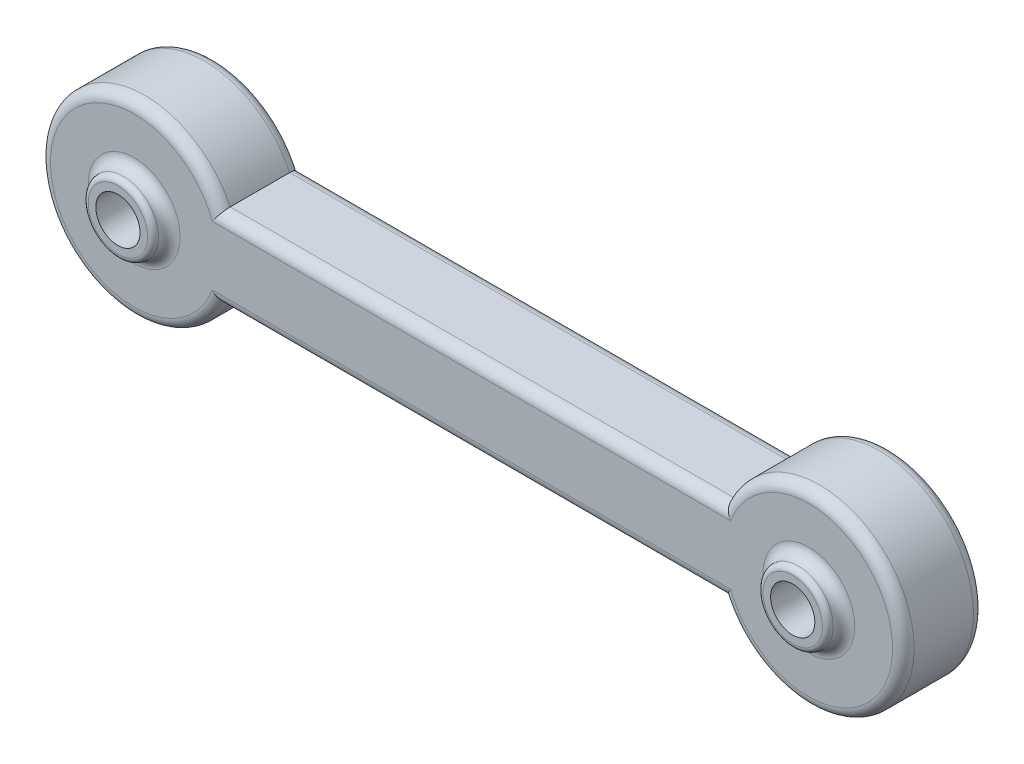
ISO-10303-21;
HEADER;
FILE_DESCRIPTION(('STEP AP214'),'2;1');
FILE_NAME('part.step','',(''),(''),'','','');
FILE_SCHEMA(('AUTOMOTIVE_DESIGN { 1 0 10303 214 1 1 1 1 }'));
ENDSEC;
DATA;
#1=APPLICATION_CONTEXT('core data for automotive mechanical design processes');
#2=APPLICATION_PROTOCOL_DEFINITION('international standard','automotive_design',2000,#1);
#3=PRODUCT_CONTEXT('',#1,'mechanical');
#4=PRODUCT('Part','Part','',(#3));
#5=PRODUCT_RELATED_PRODUCT_CATEGORY('part','',(#4));
#6=PRODUCT_DEFINITION_FORMATION('','',#4);
#7=PRODUCT_DEFINITION_CONTEXT('part definition',#1,'design');
#8=PRODUCT_DEFINITION('design','',#6,#7);
#9=PRODUCT_DEFINITION_SHAPE('','',#8);
#10=(LENGTH_UNIT() NAMED_UNIT(*) SI_UNIT(.MILLI.,.METRE.));
#11=(NAMED_UNIT(*) PLANE_ANGLE_UNIT() SI_UNIT($,.RADIAN.));
#12=(NAMED_UNIT(*) SI_UNIT($,.STERADIAN.) SOLID_ANGLE_UNIT());
#13=UNCERTAINTY_MEASURE_WITH_UNIT(LENGTH_MEASURE(1.E-05),#10,'distance_accuracy_value','');
#14=(GEOMETRIC_REPRESENTATION_CONTEXT(3) GLOBAL_UNCERTAINTY_ASSIGNED_CONTEXT((#13)) GLOBAL_UNIT_ASSIGNED_CONTEXT((#10,
#11,#12)) REPRESENTATION_CONTEXT('',''));
#15=CARTESIAN_POINT('',(0.,0.,0.));
#16=DIRECTION('',(0.,0.,1.));
#17=DIRECTION('',(1.,0.,0.));
#18=AXIS2_PLACEMENT_3D('',#15,#16,#17);
#19=CARTESIAN_POINT('',(-62.5,0.,15.));
#20=DIRECTION('',(0.,0.,1.));
#21=DIRECTION('',(1.,0.,0.));
#22=AXIS2_PLACEMENT_3D('',#19,#20,#21);
#23=PLANE('',#22);
#24=CARTESIAN_POINT('',(62.5,0.,15.));
#25=DIRECTION('',(0.,0.,1.));
#26=DIRECTION('',(1.,0.,0.));
#27=AXIS2_PLACEMENT_3D('',#24,#25,#26);
#28=CIRCLE('',#27,8.49999999999999);
#29=CARTESIAN_POINT('',(71.,0.,15.));
#30=VERTEX_POINT('',#29);
#31=EDGE_CURVE('E157',#30,#30,#28,.F.);
#32=ORIENTED_EDGE('',*,*,#31,.T.);
#33=EDGE_LOOP('',(#32));
#34=FACE_BOUND('',#33,.T.);
#35=CARTESIAN_POINT('',(62.5,0.,15.));
#36=DIRECTION('',(0.,0.,1.));
#37=DIRECTION('',(1.,0.,0.));
#38=AXIS2_PLACEMENT_3D('',#35,#36,#37);
#39=CIRCLE('',#38,15.5);
#40=CARTESIAN_POINT('',(48.0086232538106,-5.50000000000001,15.));
#41=VERTEX_POINT('',#40);
#42=CARTESIAN_POINT('',(48.0086232538106,5.49999999999999,15.));
#43=VERTEX_POINT('',#42);
#44=EDGE_CURVE('E154',#41,#43,#39,.T.);
#45=ORIENTED_EDGE('',*,*,#44,.T.);
#46=DIRECTION('',(-1.,0.,0.));
#47=VECTOR('',#46,1.);
#48=CARTESIAN_POINT('',(-46.6886116991581,5.49999999999999,15.));
#49=LINE('',#48,#47);
#50=CARTESIAN_POINT('',(-48.0086232538106,5.49999999999999,15.));
#51=VERTEX_POINT('',#50);
#52=EDGE_CURVE('E133',#43,#51,#49,.T.);
#53=ORIENTED_EDGE('',*,*,#52,.T.);
#54=CARTESIAN_POINT('',(-62.5,0.,15.));
#55=DIRECTION('',(0.,0.,1.));
#56=DIRECTION('',(1.,0.,0.));
#57=AXIS2_PLACEMENT_3D('',#54,#55,#56);
#58=CIRCLE('',#57,15.5);
#59=CARTESIAN_POINT('',(-48.0086232538106,-5.50000000000001,15.));
#60=VERTEX_POINT('',#59);
#61=EDGE_CURVE('E142',#51,#60,#58,.T.);
#62=ORIENTED_EDGE('',*,*,#61,.T.);
#63=DIRECTION('',(1.,0.,0.));
#64=VECTOR('',#63,1.);
#65=CARTESIAN_POINT('',(46.6886116991581,-5.50000000000001,15.));
#66=LINE('',#65,#64);
#67=EDGE_CURVE('E149',#60,#41,#66,.T.);
#68=ORIENTED_EDGE('',*,*,#67,.T.);
#69=EDGE_LOOP('',(#45,#53,#62,#68));
#70=FACE_BOUND('',#69,.T.);
#71=CARTESIAN_POINT('',(-62.5,0.,15.));
#72=DIRECTION('',(0.,0.,1.));
#73=DIRECTION('',(1.,0.,0.));
#74=AXIS2_PLACEMENT_3D('',#71,#72,#73);
#75=CIRCLE('',#74,8.49999999999999);
#76=CARTESIAN_POINT('',(-54.,0.,15.));
#77=VERTEX_POINT('',#76);
#78=EDGE_CURVE('E150',#77,#77,#75,.F.);
#79=ORIENTED_EDGE('',*,*,#78,.T.);
#80=EDGE_LOOP('',(#79));
#81=FACE_BOUND('',#80,.T.);
#82=ADVANCED_FACE('F40',(#34,#70,#81),#23,.T.);
#83=CARTESIAN_POINT('',(-62.5,0.,0.));
#84=DIRECTION('',(0.,0.,1.));
#85=DIRECTION('',(1.,0.,0.));
#86=AXIS2_PLACEMENT_3D('',#83,#84,#85);
#87=PLANE('',#86);
#88=CARTESIAN_POINT('',(-62.5,0.,0.));
#89=DIRECTION('',(0.,0.,1.));
#90=DIRECTION('',(1.,0.,0.));
#91=AXIS2_PLACEMENT_3D('',#88,#89,#90);
#92=CIRCLE('',#91,8.49999999999999);
#93=CARTESIAN_POINT('',(-54.,0.,0.));
#94=VERTEX_POINT('',#93);
#95=EDGE_CURVE('E11',#94,#94,#92,.T.);
#96=ORIENTED_EDGE('',*,*,#95,.T.);
#97=EDGE_LOOP('',(#96));
#98=FACE_BOUND('',#97,.T.);
#99=CARTESIAN_POINT('',(62.5,0.,0.));
#100=DIRECTION('',(0.,0.,1.));
#101=DIRECTION('',(1.,0.,0.));
#102=AXIS2_PLACEMENT_3D('',#99,#100,#101);
#103=CIRCLE('',#102,8.49999999999999);
#104=CARTESIAN_POINT('',(71.,0.,0.));
#105=VERTEX_POINT('',#104);
#106=EDGE_CURVE('E54',#105,#105,#103,.T.);
#107=ORIENTED_EDGE('',*,*,#106,.T.);
#108=EDGE_LOOP('',(#107));
#109=FACE_BOUND('',#108,.T.);
#110=CARTESIAN_POINT('',(62.5,0.,0.));
#111=DIRECTION('',(0.,0.,1.));
#112=DIRECTION('',(1.,0.,0.));
#113=AXIS2_PLACEMENT_3D('',#110,#111,#112);
#114=CIRCLE('',#113,15.5);
#115=CARTESIAN_POINT('',(48.0086232538106,5.49999999999999,0.));
#116=VERTEX_POINT('',#115);
#117=CARTESIAN_POINT('',(48.0086232538106,-5.50000000000001,0.));
#118=VERTEX_POINT('',#117);
#119=EDGE_CURVE('E65',#116,#118,#114,.F.);
#120=ORIENTED_EDGE('',*,*,#119,.T.);
#121=DIRECTION('',(1.,0.,0.));
#122=VECTOR('',#121,1.);
#123=CARTESIAN_POINT('',(-62.5,-5.50000000000001,0.));
#124=LINE('',#123,#122);
#125=CARTESIAN_POINT('',(-48.0086232538106,-5.50000000000001,0.));
#126=VERTEX_POINT('',#125);
#127=EDGE_CURVE('E199',#118,#126,#124,.F.);
#128=ORIENTED_EDGE('',*,*,#127,.T.);
#129=CARTESIAN_POINT('',(-62.5,0.,0.));
#130=DIRECTION('',(0.,0.,1.));
#131=DIRECTION('',(1.,0.,0.));
#132=AXIS2_PLACEMENT_3D('',#129,#130,#131);
#133=CIRCLE('',#132,15.5);
#134=CARTESIAN_POINT('',(-48.0086232538106,5.49999999999999,0.));
#135=VERTEX_POINT('',#134);
#136=EDGE_CURVE('E192',#126,#135,#133,.F.);
#137=ORIENTED_EDGE('',*,*,#136,.T.);
#138=DIRECTION('',(-1.,0.,0.));
#139=VECTOR('',#138,1.);
#140=CARTESIAN_POINT('',(-62.5,5.49999999999999,0.));
#141=LINE('',#140,#139);
#142=EDGE_CURVE('E71',#135,#116,#141,.F.);
#143=ORIENTED_EDGE('',*,*,#142,.T.);
#144=EDGE_LOOP('',(#120,#128,#137,#143));
#145=FACE_BOUND('',#144,.T.);
#146=ADVANCED_FACE('F282',(#98,#109,#145),#87,.F.);
#147=CARTESIAN_POINT('',(-62.5,0.,15.));
#148=DIRECTION('',(0.,0.,-1.));
#149=DIRECTION('',(-1.,0.,0.));
#150=AXIS2_PLACEMENT_3D('',#147,#148,#149);
#151=CYLINDRICAL_SURFACE('',#150,17.5);
#152=DIRECTION('',(0.,0.,-1.));
#153=VECTOR('',#152,1.);
#154=CARTESIAN_POINT('',(-46.6886116991581,-7.50000000000001,15.));
#155=LINE('',#154,#153);
#156=CARTESIAN_POINT('',(-46.6886116991581,-7.50000000000001,13.));
#157=VERTEX_POINT('',#156);
#158=CARTESIAN_POINT('',(-46.6886116991581,-7.50000000000001,2.));
#159=VERTEX_POINT('',#158);
#160=EDGE_CURVE('E397',#157,#159,#155,.T.);
#161=ORIENTED_EDGE('',*,*,#160,.F.);
#162=CARTESIAN_POINT('',(-62.5,0.,13.));
#163=DIRECTION('',(0.,0.,1.));
#164=DIRECTION('',(1.,0.,0.));
#165=AXIS2_PLACEMENT_3D('',#162,#163,#164);
#166=CIRCLE('',#165,17.5);
#167=CARTESIAN_POINT('',(-46.6886116991581,7.49999999999999,13.));
#168=VERTEX_POINT('',#167);
#169=EDGE_CURVE('E189',#157,#168,#166,.F.);
#170=ORIENTED_EDGE('',*,*,#169,.T.);
#171=DIRECTION('',(0.,0.,-1.));
#172=VECTOR('',#171,1.);
#173=CARTESIAN_POINT('',(-46.6886116991581,7.49999999999999,15.));
#174=LINE('',#173,#172);
#175=CARTESIAN_POINT('',(-46.6886116991581,7.49999999999999,2.));
#176=VERTEX_POINT('',#175);
#177=EDGE_CURVE('E385',#168,#176,#174,.T.);
#178=ORIENTED_EDGE('',*,*,#177,.T.);
#179=CARTESIAN_POINT('',(-62.5,0.,2.));
#180=DIRECTION('',(0.,0.,1.));
#181=DIRECTION('',(1.,0.,0.));
#182=AXIS2_PLACEMENT_3D('',#179,#180,#181);
#183=CIRCLE('',#182,17.5);
#184=EDGE_CURVE('E186',#176,#159,#183,.T.);
#185=ORIENTED_EDGE('',*,*,#184,.T.);
#186=EDGE_LOOP('',(#161,#170,#178,#185));
#187=FACE_BOUND('',#186,.T.);
#188=ADVANCED_FACE('F284',(#187),#151,.T.);
#189=CARTESIAN_POINT('',(-46.6886116991581,-7.50000000000001,15.));
#190=DIRECTION('',(0.,1.,0.));
#191=DIRECTION('',(0.,0.,1.));
#192=AXIS2_PLACEMENT_3D('',#189,#190,#191);
#193=PLANE('',#192);
#194=DIRECTION('',(0.,0.,-1.));
#195=VECTOR('',#194,1.);
#196=CARTESIAN_POINT('',(46.6886116991581,-7.5,15.));
#197=LINE('',#196,#195);
#198=CARTESIAN_POINT('',(46.6886116991581,-7.5,13.));
#199=VERTEX_POINT('',#198);
#200=CARTESIAN_POINT('',(46.6886116991581,-7.5,2.));
#201=VERTEX_POINT('',#200);
#202=EDGE_CURVE('E393',#199,#201,#197,.T.);
#203=ORIENTED_EDGE('',*,*,#202,.F.);
#204=DIRECTION('',(1.,0.,0.));
#205=VECTOR('',#204,1.);
#206=CARTESIAN_POINT('',(-46.6886116991581,-7.50000000000001,13.));
#207=LINE('',#206,#205);
#208=EDGE_CURVE('E183',#199,#157,#207,.F.);
#209=ORIENTED_EDGE('',*,*,#208,.T.);
#210=ORIENTED_EDGE('',*,*,#160,.T.);
#211=DIRECTION('',(1.,0.,0.));
#212=VECTOR('',#211,1.);
#213=CARTESIAN_POINT('',(-46.6886116991581,-7.50000000000001,2.));
#214=LINE('',#213,#212);
#215=EDGE_CURVE('E179',#159,#201,#214,.T.);
#216=ORIENTED_EDGE('',*,*,#215,.T.);
#217=EDGE_LOOP('',(#203,#209,#210,#216));
#218=FACE_BOUND('',#217,.T.);
#219=ADVANCED_FACE('F291',(#218),#193,.F.);
#220=CARTESIAN_POINT('',(62.5,0.,15.));
#221=DIRECTION('',(0.,0.,-1.));
#222=DIRECTION('',(-1.,0.,0.));
#223=AXIS2_PLACEMENT_3D('',#220,#221,#222);
#224=CYLINDRICAL_SURFACE('',#223,17.5);
#225=DIRECTION('',(0.,0.,-1.));
#226=VECTOR('',#225,1.);
#227=CARTESIAN_POINT('',(46.6886116991581,7.49999999999999,15.));
#228=LINE('',#227,#226);
#229=CARTESIAN_POINT('',(46.6886116991581,7.49999999999999,13.));
#230=VERTEX_POINT('',#229);
#231=CARTESIAN_POINT('',(46.6886116991581,7.49999999999999,2.));
#232=VERTEX_POINT('',#231);
#233=EDGE_CURVE('E389',#230,#232,#228,.T.);
#234=ORIENTED_EDGE('',*,*,#233,.F.);
#235=CARTESIAN_POINT('',(62.5,0.,13.));
#236=DIRECTION('',(0.,0.,1.));
#237=DIRECTION('',(1.,0.,0.));
#238=AXIS2_PLACEMENT_3D('',#235,#236,#237);
#239=CIRCLE('',#238,17.5);
#240=EDGE_CURVE('E176',#230,#199,#239,.F.);
#241=ORIENTED_EDGE('',*,*,#240,.T.);
#242=ORIENTED_EDGE('',*,*,#202,.T.);
#243=CARTESIAN_POINT('',(62.5,0.,2.));
#244=DIRECTION('',(0.,0.,1.));
#245=DIRECTION('',(1.,0.,0.));
#246=AXIS2_PLACEMENT_3D('',#243,#244,#245);
#247=CIRCLE('',#246,17.5);
#248=EDGE_CURVE('E173',#201,#232,#247,.T.);
#249=ORIENTED_EDGE('',*,*,#248,.T.);
#250=EDGE_LOOP('',(#234,#241,#242,#249));
#251=FACE_BOUND('',#250,.T.);
#252=ADVANCED_FACE('F303',(#251),#224,.T.);
#253=CARTESIAN_POINT('',(-46.6886116991581,7.49999999999999,15.));
#254=DIRECTION('',(0.,-1.,0.));
#255=DIRECTION('',(0.,0.,-1.));
#256=AXIS2_PLACEMENT_3D('',#253,#254,#255);
#257=PLANE('',#256);
#258=ORIENTED_EDGE('',*,*,#177,.F.);
#259=DIRECTION('',(-1.,0.,0.));
#260=VECTOR('',#259,1.);
#261=CARTESIAN_POINT('',(46.6886116991581,7.49999999999999,13.));
#262=LINE('',#261,#260);
#263=EDGE_CURVE('E135',#168,#230,#262,.F.);
#264=ORIENTED_EDGE('',*,*,#263,.T.);
#265=ORIENTED_EDGE('',*,*,#233,.T.);
#266=DIRECTION('',(-1.,0.,0.));
#267=VECTOR('',#266,1.);
#268=CARTESIAN_POINT('',(-46.6886116991581,7.49999999999999,2.));
#269=LINE('',#268,#267);
#270=EDGE_CURVE('E163',#232,#176,#269,.T.);
#271=ORIENTED_EDGE('',*,*,#270,.T.);
#272=EDGE_LOOP('',(#258,#264,#265,#271));
#273=FACE_BOUND('',#272,.T.);
#274=ADVANCED_FACE('F299',(#273),#257,.F.);
#275=CARTESIAN_POINT('',(62.5,0.,15.));
#276=DIRECTION('',(0.,0.,-1.));
#277=DIRECTION('',(-1.,0.,0.));
#278=AXIS2_PLACEMENT_3D('',#275,#276,#277);
#279=CYLINDRICAL_SURFACE('',#278,4.09999999999999);
#280=CARTESIAN_POINT('',(62.5,0.,-3.));
#281=DIRECTION('',(0.,0.,1.));
#282=DIRECTION('',(1.,0.,0.));
#283=AXIS2_PLACEMENT_3D('',#280,#281,#282);
#284=CIRCLE('',#283,4.09999999999999);
#285=CARTESIAN_POINT('',(66.6,0.,-3.));
#286=VERTEX_POINT('',#285);
#287=EDGE_CURVE('E381',#286,#286,#284,.T.);
#288=ORIENTED_EDGE('',*,*,#287,.F.);
#289=EDGE_LOOP('',(#288));
#290=FACE_BOUND('',#289,.T.);
#291=CARTESIAN_POINT('',(62.5,0.,18.));
#292=DIRECTION('',(0.,0.,1.));
#293=DIRECTION('',(1.,0.,0.));
#294=AXIS2_PLACEMENT_3D('',#291,#292,#293);
#295=CIRCLE('',#294,4.09999999999999);
#296=CARTESIAN_POINT('',(66.6,0.,18.));
#297=VERTEX_POINT('',#296);
#298=EDGE_CURVE('E371',#297,#297,#295,.T.);
#299=ORIENTED_EDGE('',*,*,#298,.T.);
#300=EDGE_LOOP('',(#299));
#301=FACE_BOUND('',#300,.T.);
#302=ADVANCED_FACE('F302',(#290,#301),#279,.F.);
#303=CARTESIAN_POINT('',(-62.5,0.,15.));
#304=DIRECTION('',(0.,0.,-1.));
#305=DIRECTION('',(-1.,0.,0.));
#306=AXIS2_PLACEMENT_3D('',#303,#304,#305);
#307=CYLINDRICAL_SURFACE('',#306,4.09999999999999);
#308=CARTESIAN_POINT('',(-62.5,0.,-3.));
#309=DIRECTION('',(0.,0.,-1.));
#310=DIRECTION('',(-1.,0.,0.));
#311=AXIS2_PLACEMENT_3D('',#308,#309,#310);
#312=CIRCLE('',#311,4.09999999999999);
#313=CARTESIAN_POINT('',(-66.6,0.,-3.));
#314=VERTEX_POINT('',#313);
#315=EDGE_CURVE('E367',#314,#314,#312,.T.);
#316=ORIENTED_EDGE('',*,*,#315,.T.);
#317=EDGE_LOOP('',(#316));
#318=FACE_BOUND('',#317,.T.);
#319=CARTESIAN_POINT('',(-62.5,0.,18.));
#320=DIRECTION('',(0.,0.,-1.));
#321=DIRECTION('',(-1.,0.,0.));
#322=AXIS2_PLACEMENT_3D('',#319,#320,#321);
#323=CIRCLE('',#322,4.09999999999999);
#324=CARTESIAN_POINT('',(-66.6,0.,18.));
#325=VERTEX_POINT('',#324);
#326=EDGE_CURVE('E237',#325,#325,#323,.T.);
#327=ORIENTED_EDGE('',*,*,#326,.F.);
#328=EDGE_LOOP('',(#327));
#329=FACE_BOUND('',#328,.T.);
#330=ADVANCED_FACE('F423',(#318,#329),#307,.F.);
#331=CARTESIAN_POINT('',(62.5,0.,-3.));
#332=DIRECTION('',(0.,0.,1.));
#333=DIRECTION('',(1.,0.,0.));
#334=AXIS2_PLACEMENT_3D('',#331,#332,#333);
#335=PLANE('',#334);
#336=CARTESIAN_POINT('',(62.5,0.,-3.));
#337=DIRECTION('',(0.,0.,1.));
#338=DIRECTION('',(1.,0.,0.));
#339=AXIS2_PLACEMENT_3D('',#336,#337,#338);
#340=CIRCLE('',#339,5.49999999999999);
#341=CARTESIAN_POINT('',(68.,0.,-3.));
#342=VERTEX_POINT('',#341);
#343=EDGE_CURVE('E404',#342,#342,#340,.F.);
#344=ORIENTED_EDGE('',*,*,#343,.T.);
#345=EDGE_LOOP('',(#344));
#346=FACE_BOUND('',#345,.T.);
#347=ORIENTED_EDGE('',*,*,#287,.T.);
#348=EDGE_LOOP('',(#347));
#349=FACE_BOUND('',#348,.T.);
#350=ADVANCED_FACE('F315',(#346,#349),#335,.F.);
#351=CARTESIAN_POINT('',(62.5,0.,-2.));
#352=DIRECTION('',(0.,0.,1.));
#353=DIRECTION('',(1.,0.,0.));
#354=AXIS2_PLACEMENT_3D('',#351,#352,#353);
#355=TOROIDAL_SURFACE('',#354,5.49999999999999,1.);
#356=ORIENTED_EDGE('',*,*,#343,.F.);
#357=EDGE_LOOP('',(#356));
#358=FACE_BOUND('',#357,.T.);
#359=CARTESIAN_POINT('',(62.5,0.,-2.));
#360=DIRECTION('',(0.,0.,1.));
#361=DIRECTION('',(1.,0.,0.));
#362=AXIS2_PLACEMENT_3D('',#359,#360,#361);
#363=CIRCLE('',#362,6.49999999999999);
#364=CARTESIAN_POINT('',(69.,0.,-2.));
#365=VERTEX_POINT('',#364);
#366=EDGE_CURVE('E400',#365,#365,#363,.T.);
#367=ORIENTED_EDGE('',*,*,#366,.F.);
#368=EDGE_LOOP('',(#367));
#369=FACE_BOUND('',#368,.T.);
#370=ADVANCED_FACE('F311',(#358,#369),#355,.T.);
#371=CARTESIAN_POINT('',(-62.5,0.,-3.));
#372=DIRECTION('',(0.,0.,1.));
#373=DIRECTION('',(-1.,0.,0.));
#374=AXIS2_PLACEMENT_3D('',#371,#372,#373);
#375=PLANE('',#374);
#376=CARTESIAN_POINT('',(-62.5,0.,-3.));
#377=DIRECTION('',(0.,0.,1.));
#378=DIRECTION('',(1.,0.,0.));
#379=AXIS2_PLACEMENT_3D('',#376,#377,#378);
#380=CIRCLE('',#379,5.49999999999999);
#381=CARTESIAN_POINT('',(-57.,0.,-3.));
#382=VERTEX_POINT('',#381);
#383=EDGE_CURVE('E408',#382,#382,#380,.F.);
#384=ORIENTED_EDGE('',*,*,#383,.T.);
#385=EDGE_LOOP('',(#384));
#386=FACE_BOUND('',#385,.T.);
#387=ORIENTED_EDGE('',*,*,#315,.F.);
#388=EDGE_LOOP('',(#387));
#389=FACE_BOUND('',#388,.T.);
#390=ADVANCED_FACE('F314',(#386,#389),#375,.F.);
#391=CARTESIAN_POINT('',(-62.5,0.,-2.));
#392=DIRECTION('',(0.,0.,1.));
#393=DIRECTION('',(1.,0.,0.));
#394=AXIS2_PLACEMENT_3D('',#391,#392,#393);
#395=TOROIDAL_SURFACE('',#394,5.49999999999999,1.);
#396=CARTESIAN_POINT('',(-62.5,0.,-2.));
#397=DIRECTION('',(0.,0.,1.));
#398=DIRECTION('',(1.,0.,0.));
#399=AXIS2_PLACEMENT_3D('',#396,#397,#398);
#400=CIRCLE('',#399,6.49999999999999);
#401=CARTESIAN_POINT('',(-56.,0.,-2.));
#402=VERTEX_POINT('',#401);
#403=EDGE_CURVE('E352',#402,#402,#400,.T.);
#404=ORIENTED_EDGE('',*,*,#403,.F.);
#405=EDGE_LOOP('',(#404));
#406=FACE_BOUND('',#405,.T.);
#407=ORIENTED_EDGE('',*,*,#383,.F.);
#408=EDGE_LOOP('',(#407));
#409=FACE_BOUND('',#408,.T.);
#410=ADVANCED_FACE('F317',(#406,#409),#395,.T.);
#411=CARTESIAN_POINT('',(62.5,0.,18.));
#412=DIRECTION('',(0.,0.,-1.));
#413=DIRECTION('',(1.,0.,0.));
#414=AXIS2_PLACEMENT_3D('',#411,#412,#413);
#415=PLANE('',#414);
#416=CARTESIAN_POINT('',(62.5,0.,18.));
#417=DIRECTION('',(0.,0.,-1.));
#418=DIRECTION('',(-1.,0.,0.));
#419=AXIS2_PLACEMENT_3D('',#416,#417,#418);
#420=CIRCLE('',#419,5.49999999999999);
#421=CARTESIAN_POINT('',(57.,0.,18.));
#422=VERTEX_POINT('',#421);
#423=EDGE_CURVE('E344',#422,#422,#420,.F.);
#424=ORIENTED_EDGE('',*,*,#423,.T.);
#425=EDGE_LOOP('',(#424));
#426=FACE_BOUND('',#425,.T.);
#427=ORIENTED_EDGE('',*,*,#298,.F.);
#428=EDGE_LOOP('',(#427));
#429=FACE_BOUND('',#428,.T.);
#430=ADVANCED_FACE('F320',(#426,#429),#415,.F.);
#431=CARTESIAN_POINT('',(62.5,0.,17.));
#432=DIRECTION('',(0.,0.,-1.));
#433=DIRECTION('',(-1.,0.,0.));
#434=AXIS2_PLACEMENT_3D('',#431,#432,#433);
#435=TOROIDAL_SURFACE('',#434,5.49999999999999,1.);
#436=CARTESIAN_POINT('',(62.5,0.,17.));
#437=DIRECTION('',(0.,0.,-1.));
#438=DIRECTION('',(-1.,0.,0.));
#439=AXIS2_PLACEMENT_3D('',#436,#437,#438);
#440=CIRCLE('',#439,6.49999999999999);
#441=CARTESIAN_POINT('',(56.,0.,17.));
#442=VERTEX_POINT('',#441);
#443=EDGE_CURVE('E341',#442,#442,#440,.T.);
#444=ORIENTED_EDGE('',*,*,#443,.F.);
#445=EDGE_LOOP('',(#444));
#446=FACE_BOUND('',#445,.T.);
#447=ORIENTED_EDGE('',*,*,#423,.F.);
#448=EDGE_LOOP('',(#447));
#449=FACE_BOUND('',#448,.T.);
#450=ADVANCED_FACE('F322',(#446,#449),#435,.T.);
#451=CARTESIAN_POINT('',(-62.5,0.,18.));
#452=DIRECTION('',(0.,0.,-1.));
#453=DIRECTION('',(-1.,0.,0.));
#454=AXIS2_PLACEMENT_3D('',#451,#452,#453);
#455=PLANE('',#454);
#456=CARTESIAN_POINT('',(-62.5,0.,18.));
#457=DIRECTION('',(0.,0.,-1.));
#458=DIRECTION('',(-1.,0.,0.));
#459=AXIS2_PLACEMENT_3D('',#456,#457,#458);
#460=CIRCLE('',#459,5.49999999999999);
#461=CARTESIAN_POINT('',(-68.,0.,18.));
#462=VERTEX_POINT('',#461);
#463=EDGE_CURVE('E349',#462,#462,#460,.F.);
#464=ORIENTED_EDGE('',*,*,#463,.T.);
#465=EDGE_LOOP('',(#464));
#466=FACE_BOUND('',#465,.T.);
#467=ORIENTED_EDGE('',*,*,#326,.T.);
#468=EDGE_LOOP('',(#467));
#469=FACE_BOUND('',#468,.T.);
#470=ADVANCED_FACE('F325',(#466,#469),#455,.F.);
#471=CARTESIAN_POINT('',(-62.5,0.,17.));
#472=DIRECTION('',(0.,0.,-1.));
#473=DIRECTION('',(-1.,0.,0.));
#474=AXIS2_PLACEMENT_3D('',#471,#472,#473);
#475=TOROIDAL_SURFACE('',#474,5.49999999999999,1.);
#476=ORIENTED_EDGE('',*,*,#463,.F.);
#477=EDGE_LOOP('',(#476));
#478=FACE_BOUND('',#477,.T.);
#479=CARTESIAN_POINT('',(-62.5,0.,17.));
#480=DIRECTION('',(0.,0.,-1.));
#481=DIRECTION('',(-1.,0.,0.));
#482=AXIS2_PLACEMENT_3D('',#479,#480,#481);
#483=CIRCLE('',#482,6.49999999999999);
#484=CARTESIAN_POINT('',(-69.,0.,17.));
#485=VERTEX_POINT('',#484);
#486=EDGE_CURVE('E343',#485,#485,#483,.T.);
#487=ORIENTED_EDGE('',*,*,#486,.F.);
#488=EDGE_LOOP('',(#487));
#489=FACE_BOUND('',#488,.T.);
#490=ADVANCED_FACE('F327',(#478,#489),#475,.T.);
#491=CARTESIAN_POINT('',(62.5,0.,17.));
#492=DIRECTION('',(0.,0.,1.));
#493=DIRECTION('',(1.,0.,0.));
#494=AXIS2_PLACEMENT_3D('',#491,#492,#493);
#495=TOROIDAL_SURFACE('',#494,8.49999999999999,2.);
#496=ORIENTED_EDGE('',*,*,#31,.F.);
#497=EDGE_LOOP('',(#496));
#498=FACE_BOUND('',#497,.T.);
#499=ORIENTED_EDGE('',*,*,#443,.T.);
#500=EDGE_LOOP('',(#499));
#501=FACE_BOUND('',#500,.T.);
#502=ADVANCED_FACE('F329',(#498,#501),#495,.F.);
#503=CARTESIAN_POINT('',(-62.5,-5.50000000000001,13.));
#504=DIRECTION('',(-1.,0.,0.));
#505=DIRECTION('',(0.,0.,1.));
#506=AXIS2_PLACEMENT_3D('',#503,#504,#505);
#507=CYLINDRICAL_SURFACE('',#506,2.);
#508=CARTESIAN_POINT('',(-46.6886116991581,-7.50000000000001,13.));
#509=CARTESIAN_POINT('',(-46.6886065551108,-7.50000900211604,13.0499395088161));
#510=CARTESIAN_POINT('',(-46.6897945450615,-7.49812977736589,13.0998738476769));
#511=CARTESIAN_POINT('',(-46.6945172382144,-7.49066375799004,13.1993353424041));
#512=CARTESIAN_POINT('',(-46.6980510946208,-7.48507830121623,13.2488626386733));
#513=CARTESIAN_POINT('',(-46.7074045248442,-7.47030256383435,13.3469244466569));
#514=CARTESIAN_POINT('',(-46.7132135436086,-7.4611289299432,13.3954624692885));
#515=CARTESIAN_POINT('',(-46.7270393086369,-7.43931207078719,13.4914197101416));
#516=CARTESIAN_POINT('',(-46.7350561624198,-7.42666867654898,13.5388388737538));
#517=CARTESIAN_POINT('',(-46.7622678059413,-7.38379411558222,13.6788309149175));
#518=CARTESIAN_POINT('',(-46.7846423237479,-7.34858900579416,13.769329645877));
#519=CARTESIAN_POINT('',(-46.8369109312779,-7.2665839975759,13.9425477472262));
#520=CARTESIAN_POINT('',(-46.86681199892,-7.21977334016847,14.0252598002143));
#521=CARTESIAN_POINT('',(-46.9348917661752,-7.11356878347685,14.1858160728352));
#522=CARTESIAN_POINT('',(-46.9734370068151,-7.05362184221193,14.2631375167456));
#523=CARTESIAN_POINT('',(-47.0564349781273,-6.92509888936938,14.4065483840065));
#524=CARTESIAN_POINT('',(-47.1008889093871,-6.85652112424449,14.4726355184204));
#525=CARTESIAN_POINT('',(-47.2013960010555,-6.70222054663586,14.6019420695584));
#526=CARTESIAN_POINT('',(-47.2581952053352,-6.61545607625738,14.6633362814498));
#527=CARTESIAN_POINT('',(-47.3765561024593,-6.43575212668637,14.7706912307699));
#528=CARTESIAN_POINT('',(-47.4381239937184,-6.34280463361379,14.8166314521941));
#529=CARTESIAN_POINT('',(-47.5812283672705,-6.12816949913105,14.9031739890576));
#530=CARTESIAN_POINT('',(-47.6637758642881,-6.0053232763442,14.9392374560119));
#531=CARTESIAN_POINT('',(-47.8318768212536,-5.75733948482867,14.9873826693914));
#532=CARTESIAN_POINT('',(-47.9174241129172,-5.63220684532844,14.9995109912395));
#533=CARTESIAN_POINT('',(-48.0051209751542,-5.50507573977418,14.999995173736));
#534=CARTESIAN_POINT('',(-48.006872036742,-5.50253775026879,15.0000000040247));
#535=CARTESIAN_POINT('',(-48.0086232538106,-5.50000000000001,15.));
#536=B_SPLINE_CURVE_WITH_KNOTS('',3,(#508,#509,#510,#511,#512,#513,#514,#515,#516,#517,#518,
#519,#520,#521,#522,#523,#524,#525,#526,#527,#528,#529,#530,#531,#532,#533,#534,#535),
.UNSPECIFIED.,.F.,.F.,(4,2,2,2,2,2,2,2,2,2,2,2,2,4),(0.,0.149760434254281,0.299466838333405,
0.448486790194277,0.597514000444192,0.894992489976454,1.19274779635172,1.50698264104526,
1.82128143304112,2.18143671032965,2.54206824345128,2.99702322440659,3.45109203165253,
3.46034234732407),.UNSPECIFIED.);
#537=EDGE_CURVE('E145',#157,#60,#536,.T.);
#538=ORIENTED_EDGE('',*,*,#537,.F.);
#539=ORIENTED_EDGE('',*,*,#208,.F.);
#540=CARTESIAN_POINT('',(46.6886116991581,-7.5,13.));
#541=CARTESIAN_POINT('',(46.6886065551108,-7.50000900211604,13.0499395088161));
#542=CARTESIAN_POINT('',(46.6897945450615,-7.49812977736589,13.0998738476769));
#543=CARTESIAN_POINT('',(46.6945172382144,-7.49066375799004,13.1993353424041));
#544=CARTESIAN_POINT('',(46.6980510946208,-7.48507830121623,13.2488626386733));
#545=CARTESIAN_POINT('',(46.7074045248442,-7.47030256383435,13.3469244466569));
#546=CARTESIAN_POINT('',(46.7132135436086,-7.4611289299432,13.3954624692885));
#547=CARTESIAN_POINT('',(46.7270393086369,-7.43931207078719,13.4914197101416));
#548=CARTESIAN_POINT('',(46.7350561624198,-7.42666867654898,13.5388388737538));
#549=CARTESIAN_POINT('',(46.7622678059413,-7.38379411558222,13.6788309149175));
#550=CARTESIAN_POINT('',(46.7846423237479,-7.34858900579416,13.769329645877));
#551=CARTESIAN_POINT('',(46.8369109312779,-7.2665839975759,13.9425477472262));
#552=CARTESIAN_POINT('',(46.86681199892,-7.21977334016847,14.0252598002143));
#553=CARTESIAN_POINT('',(46.9348917661752,-7.11356878347685,14.1858160728352));
#554=CARTESIAN_POINT('',(46.9734370068151,-7.05362184221193,14.2631375167456));
#555=CARTESIAN_POINT('',(47.0564349781273,-6.92509888936938,14.4065483840065));
#556=CARTESIAN_POINT('',(47.1008889093871,-6.85652112424449,14.4726355184204));
#557=CARTESIAN_POINT('',(47.2013960010555,-6.70222054663586,14.6019420695584));
#558=CARTESIAN_POINT('',(47.2581952053352,-6.61545607625738,14.6633362814498));
#559=CARTESIAN_POINT('',(47.3765561024593,-6.43575212668637,14.7706912307699));
#560=CARTESIAN_POINT('',(47.4381239937184,-6.34280463361379,14.8166314521941));
#561=CARTESIAN_POINT('',(47.5812283672705,-6.12816949913105,14.9031739890576));
#562=CARTESIAN_POINT('',(47.6637758642881,-6.0053232763442,14.9392374560119));
#563=CARTESIAN_POINT('',(47.8318768212536,-5.75733948482867,14.9873826693914));
#564=CARTESIAN_POINT('',(47.9174241129172,-5.63220684532844,14.9995109912395));
#565=CARTESIAN_POINT('',(48.0051209751542,-5.50507573977418,14.999995173736));
#566=CARTESIAN_POINT('',(48.006872036742,-5.50253775026879,15.0000000040247));
#567=CARTESIAN_POINT('',(48.0086232538106,-5.50000000000001,15.));
#568=B_SPLINE_CURVE_WITH_KNOTS('',3,(#540,#541,#542,#543,#544,#545,#546,#547,#548,#549,#550,
#551,#552,#553,#554,#555,#556,#557,#558,#559,#560,#561,#562,#563,#564,#565,#566,#567),
.UNSPECIFIED.,.F.,.F.,(4,2,2,2,2,2,2,2,2,2,2,2,2,4),(0.,0.149760434254281,0.299466838333405,
0.448486790194277,0.597514000444192,0.894992489976454,1.19274779635172,1.50698264104526,
1.82128143304112,2.18143671032965,2.54206824345128,2.99702322440659,3.45109203165253,
3.46034234732407),.UNSPECIFIED.);
#569=EDGE_CURVE('E230',#41,#199,#568,.F.);
#570=ORIENTED_EDGE('',*,*,#569,.F.);
#571=ORIENTED_EDGE('',*,*,#67,.F.);
#572=EDGE_LOOP('',(#538,#539,#570,#571));
#573=FACE_BOUND('',#572,.T.);
#574=ADVANCED_FACE('F224',(#573),#507,.T.);
#575=CARTESIAN_POINT('',(62.5,0.,13.));
#576=DIRECTION('',(0.,0.,1.));
#577=DIRECTION('',(1.,0.,0.));
#578=AXIS2_PLACEMENT_3D('',#575,#576,#577);
#579=TOROIDAL_SURFACE('',#578,15.5,2.);
#580=ORIENTED_EDGE('',*,*,#569,.T.);
#581=ORIENTED_EDGE('',*,*,#240,.F.);
#582=CARTESIAN_POINT('',(46.6886116991581,7.49999999999999,13.));
#583=CARTESIAN_POINT('',(46.6886065551108,7.50000900211603,13.0499395088161));
#584=CARTESIAN_POINT('',(46.6897945450615,7.49812977736588,13.0998738476769));
#585=CARTESIAN_POINT('',(46.6945172382144,7.49066375799003,13.199335342404));
#586=CARTESIAN_POINT('',(46.6980510946208,7.48507830121622,13.2488626386733));
#587=CARTESIAN_POINT('',(46.7074045248442,7.47030256383434,13.3469244466569));
#588=CARTESIAN_POINT('',(46.7132135436086,7.46112892994319,13.3954624692885));
#589=CARTESIAN_POINT('',(46.7270393086369,7.43931207078718,13.4914197101416));
#590=CARTESIAN_POINT('',(46.7350561624198,7.42666867654897,13.5388388737538));
#591=CARTESIAN_POINT('',(46.7622678059413,7.3837941155822,13.6788309149175));
#592=CARTESIAN_POINT('',(46.7846423237479,7.34858900579415,13.769329645877));
#593=CARTESIAN_POINT('',(46.8369109312779,7.26658399757589,13.9425477472262));
#594=CARTESIAN_POINT('',(46.86681199892,7.21977334016846,14.0252598002143));
#595=CARTESIAN_POINT('',(46.9348917661752,7.11356878347684,14.1858160728352));
#596=CARTESIAN_POINT('',(46.9734370068151,7.05362184221192,14.2631375167456));
#597=CARTESIAN_POINT('',(47.0564349781273,6.92509888936937,14.4065483840065));
#598=CARTESIAN_POINT('',(47.1008889093871,6.85652112424448,14.4726355184204));
#599=CARTESIAN_POINT('',(47.2013960010555,6.70222054663585,14.6019420695584));
#600=CARTESIAN_POINT('',(47.2581952053352,6.61545607625737,14.6633362814498));
#601=CARTESIAN_POINT('',(47.3765561024593,6.43575212668636,14.7706912307699));
#602=CARTESIAN_POINT('',(47.4381239937184,6.34280463361377,14.8166314521941));
#603=CARTESIAN_POINT('',(47.5812283672705,6.12816949913104,14.9031739890576));
#604=CARTESIAN_POINT('',(47.6637758642881,6.00532327634419,14.9392374560119));
#605=CARTESIAN_POINT('',(47.8318768212536,5.75733948482865,14.9873826693914));
#606=CARTESIAN_POINT('',(47.9174241129172,5.63220684532841,14.9995109912395));
#607=CARTESIAN_POINT('',(48.0051209751542,5.50507573977417,14.999995173736));
#608=CARTESIAN_POINT('',(48.006872036742,5.50253775026878,15.0000000040247));
#609=CARTESIAN_POINT('',(48.0086232538106,5.49999999999999,15.));
#610=B_SPLINE_CURVE_WITH_KNOTS('',3,(#582,#583,#584,#585,#586,#587,#588,#589,#590,#591,#592,
#593,#594,#595,#596,#597,#598,#599,#600,#601,#602,#603,#604,#605,#606,#607,#608,#609),
.UNSPECIFIED.,.F.,.F.,(4,2,2,2,2,2,2,2,2,2,2,2,2,4),(0.,0.149760434254278,0.299466838333404,
0.448486790194277,0.597514000444192,0.894992489976454,1.19274779635172,1.50698264104526,
1.82128143304112,2.18143671032964,2.54206824345128,2.99702322440659,3.45109203165253,
3.46034234732407),.UNSPECIFIED.);
#611=EDGE_CURVE('E139',#43,#230,#610,.F.);
#612=ORIENTED_EDGE('',*,*,#611,.F.);
#613=ORIENTED_EDGE('',*,*,#44,.F.);
#614=EDGE_LOOP('',(#580,#581,#612,#613));
#615=FACE_BOUND('',#614,.T.);
#616=ADVANCED_FACE('F219',(#615),#579,.T.);
#617=CARTESIAN_POINT('',(-62.5,0.,13.));
#618=DIRECTION('',(0.,0.,1.));
#619=DIRECTION('',(1.,0.,0.));
#620=AXIS2_PLACEMENT_3D('',#617,#618,#619);
#621=TOROIDAL_SURFACE('',#620,15.5,2.);
#622=ORIENTED_EDGE('',*,*,#537,.T.);
#623=ORIENTED_EDGE('',*,*,#61,.F.);
#624=CARTESIAN_POINT('',(-46.6886116991581,7.49999999999999,13.));
#625=CARTESIAN_POINT('',(-46.6886065551108,7.50000900211603,13.0499395088161));
#626=CARTESIAN_POINT('',(-46.6897945450615,7.49812977736588,13.0998738476769));
#627=CARTESIAN_POINT('',(-46.6945172382144,7.49066375799003,13.199335342404));
#628=CARTESIAN_POINT('',(-46.6980510946208,7.48507830121622,13.2488626386733));
#629=CARTESIAN_POINT('',(-46.7074045248442,7.47030256383434,13.3469244466569));
#630=CARTESIAN_POINT('',(-46.7132135436086,7.46112892994319,13.3954624692885));
#631=CARTESIAN_POINT('',(-46.7270393086369,7.43931207078718,13.4914197101416));
#632=CARTESIAN_POINT('',(-46.7350561624198,7.42666867654897,13.5388388737538));
#633=CARTESIAN_POINT('',(-46.7622678059413,7.3837941155822,13.6788309149175));
#634=CARTESIAN_POINT('',(-46.7846423237479,7.34858900579415,13.769329645877));
#635=CARTESIAN_POINT('',(-46.8369109312779,7.26658399757589,13.9425477472262));
#636=CARTESIAN_POINT('',(-46.86681199892,7.21977334016846,14.0252598002143));
#637=CARTESIAN_POINT('',(-46.9348917661752,7.11356878347684,14.1858160728352));
#638=CARTESIAN_POINT('',(-46.9734370068151,7.05362184221192,14.2631375167456));
#639=CARTESIAN_POINT('',(-47.0564349781273,6.92509888936937,14.4065483840065));
#640=CARTESIAN_POINT('',(-47.1008889093871,6.85652112424448,14.4726355184204));
#641=CARTESIAN_POINT('',(-47.2013960010555,6.70222054663585,14.6019420695584));
#642=CARTESIAN_POINT('',(-47.2581952053352,6.61545607625737,14.6633362814498));
#643=CARTESIAN_POINT('',(-47.3765561024593,6.43575212668636,14.7706912307699));
#644=CARTESIAN_POINT('',(-47.4381239937184,6.34280463361377,14.8166314521941));
#645=CARTESIAN_POINT('',(-47.5812283672705,6.12816949913104,14.9031739890576));
#646=CARTESIAN_POINT('',(-47.6637758642881,6.00532327634419,14.9392374560119));
#647=CARTESIAN_POINT('',(-47.8318768212536,5.75733948482865,14.9873826693914));
#648=CARTESIAN_POINT('',(-47.9174241129172,5.63220684532841,14.9995109912395));
#649=CARTESIAN_POINT('',(-48.0051209751542,5.50507573977417,14.999995173736));
#650=CARTESIAN_POINT('',(-48.006872036742,5.50253775026878,15.0000000040247));
#651=CARTESIAN_POINT('',(-48.0086232538106,5.49999999999999,15.));
#652=B_SPLINE_CURVE_WITH_KNOTS('',3,(#624,#625,#626,#627,#628,#629,#630,#631,#632,#633,#634,
#635,#636,#637,#638,#639,#640,#641,#642,#643,#644,#645,#646,#647,#648,#649,#650,#651),
.UNSPECIFIED.,.F.,.F.,(4,2,2,2,2,2,2,2,2,2,2,2,2,4),(0.,0.149760434254278,0.299466838333404,
0.448486790194277,0.597514000444192,0.894992489976454,1.19274779635172,1.50698264104526,
1.82128143304112,2.18143671032964,2.54206824345128,2.99702322440659,3.45109203165253,
3.46034234732407),.UNSPECIFIED.);
#653=EDGE_CURVE('E129',#168,#51,#652,.T.);
#654=ORIENTED_EDGE('',*,*,#653,.F.);
#655=ORIENTED_EDGE('',*,*,#169,.F.);
#656=EDGE_LOOP('',(#622,#623,#654,#655));
#657=FACE_BOUND('',#656,.T.);
#658=ADVANCED_FACE('F143',(#657),#621,.T.);
#659=CARTESIAN_POINT('',(-62.5,5.49999999999999,13.));
#660=DIRECTION('',(1.,0.,0.));
#661=DIRECTION('',(0.,0.,-1.));
#662=AXIS2_PLACEMENT_3D('',#659,#660,#661);
#663=CYLINDRICAL_SURFACE('',#662,2.);
#664=ORIENTED_EDGE('',*,*,#611,.T.);
#665=ORIENTED_EDGE('',*,*,#263,.F.);
#666=ORIENTED_EDGE('',*,*,#653,.T.);
#667=ORIENTED_EDGE('',*,*,#52,.F.);
#668=EDGE_LOOP('',(#664,#665,#666,#667));
#669=FACE_BOUND('',#668,.T.);
#670=ADVANCED_FACE('F131',(#669),#663,.T.);
#671=CARTESIAN_POINT('',(-62.5,0.,17.));
#672=DIRECTION('',(0.,0.,1.));
#673=DIRECTION('',(1.,0.,0.));
#674=AXIS2_PLACEMENT_3D('',#671,#672,#673);
#675=TOROIDAL_SURFACE('',#674,8.49999999999999,2.);
#676=ORIENTED_EDGE('',*,*,#78,.F.);
#677=EDGE_LOOP('',(#676));
#678=FACE_BOUND('',#677,.T.);
#679=ORIENTED_EDGE('',*,*,#486,.T.);
#680=EDGE_LOOP('',(#679));
#681=FACE_BOUND('',#680,.T.);
#682=ADVANCED_FACE('F218',(#678,#681),#675,.F.);
#683=CARTESIAN_POINT('',(-62.5,0.,-2.));
#684=DIRECTION('',(0.,0.,1.));
#685=DIRECTION('',(1.,0.,0.));
#686=AXIS2_PLACEMENT_3D('',#683,#684,#685);
#687=TOROIDAL_SURFACE('',#686,8.49999999999999,2.);
#688=ORIENTED_EDGE('',*,*,#95,.F.);
#689=EDGE_LOOP('',(#688));
#690=FACE_BOUND('',#689,.T.);
#691=ORIENTED_EDGE('',*,*,#403,.T.);
#692=EDGE_LOOP('',(#691));
#693=FACE_BOUND('',#692,.T.);
#694=ADVANCED_FACE('F414',(#690,#693),#687,.F.);
#695=CARTESIAN_POINT('',(62.5,0.,-2.));
#696=DIRECTION('',(0.,0.,1.));
#697=DIRECTION('',(1.,0.,0.));
#698=AXIS2_PLACEMENT_3D('',#695,#696,#697);
#699=TOROIDAL_SURFACE('',#698,8.49999999999999,2.);
#700=ORIENTED_EDGE('',*,*,#366,.T.);
#701=EDGE_LOOP('',(#700));
#702=FACE_BOUND('',#701,.T.);
#703=ORIENTED_EDGE('',*,*,#106,.F.);
#704=EDGE_LOOP('',(#703));
#705=FACE_BOUND('',#704,.T.);
#706=ADVANCED_FACE('F451',(#702,#705),#699,.F.);
#707=CARTESIAN_POINT('',(-46.6886116991581,5.49999999999999,2.));
#708=DIRECTION('',(-1.,0.,0.));
#709=DIRECTION('',(0.,0.,1.));
#710=AXIS2_PLACEMENT_3D('',#707,#708,#709);
#711=CYLINDRICAL_SURFACE('',#710,2.);
#712=CARTESIAN_POINT('',(46.6886116991581,7.49999999999999,2.));
#713=CARTESIAN_POINT('',(46.6886065551108,7.50000900211603,1.9500604911839));
#714=CARTESIAN_POINT('',(46.6897945450615,7.49812977736588,1.90012615232308));
#715=CARTESIAN_POINT('',(46.6945172382144,7.49066375799003,1.80066465759595));
#716=CARTESIAN_POINT('',(46.6980510946208,7.48507830121622,1.7511373613267));
#717=CARTESIAN_POINT('',(46.7074045248442,7.47030256383434,1.65307555334307));
#718=CARTESIAN_POINT('',(46.7132135436086,7.46112892994319,1.60453753071152));
#719=CARTESIAN_POINT('',(46.7270393086369,7.43931207078718,1.50858028985842));
#720=CARTESIAN_POINT('',(46.7350561624198,7.42666867654897,1.46116112624619));
#721=CARTESIAN_POINT('',(46.7622678059413,7.3837941155822,1.32116908508248));
#722=CARTESIAN_POINT('',(46.7846423237479,7.34858900579415,1.23067035412305));
#723=CARTESIAN_POINT('',(46.8369109312779,7.26658399757589,1.05745225277378));
#724=CARTESIAN_POINT('',(46.86681199892,7.21977334016846,0.974740199785717));
#725=CARTESIAN_POINT('',(46.9348917661752,7.11356878347684,0.814183927164821));
#726=CARTESIAN_POINT('',(46.9734370068151,7.05362184221191,0.736862483254427));
#727=CARTESIAN_POINT('',(47.0564349781273,6.92509888936937,0.593451615993516));
#728=CARTESIAN_POINT('',(47.1008889093871,6.85652112424448,0.527364481579568));
#729=CARTESIAN_POINT('',(47.2013960010555,6.70222054663584,0.398057930441565));
#730=CARTESIAN_POINT('',(47.2581952053352,6.61545607625736,0.33666371855016));
#731=CARTESIAN_POINT('',(47.3765561024593,6.43575212668637,0.22930876923011));
#732=CARTESIAN_POINT('',(47.4381239937185,6.34280463361381,0.183368547805883));
#733=CARTESIAN_POINT('',(47.5812283672705,6.12816949913099,0.0968260109423769));
#734=CARTESIAN_POINT('',(47.6637758642878,6.00532327634398,0.0607625439881225));
#735=CARTESIAN_POINT('',(47.8318768212539,5.75733948482887,0.0126173306085749));
#736=CARTESIAN_POINT('',(47.9174241129183,5.63220684532921,0.000489008760448308));
#737=CARTESIAN_POINT('',(48.0051209751543,5.5050757397742,4.82626402280849E-06));
#738=CARTESIAN_POINT('',(48.006872036742,5.50253775026879,-4.02469071823334E-09));
#739=CARTESIAN_POINT('',(48.0086232538106,5.49999999999999,0.));
#740=B_SPLINE_CURVE_WITH_KNOTS('',3,(#712,#713,#714,#715,#716,#717,#718,#719,#720,#721,#722,
#723,#724,#725,#726,#727,#728,#729,#730,#731,#732,#733,#734,#735,#736,#737,#738,#739),
.UNSPECIFIED.,.F.,.F.,(4,2,2,2,2,2,2,2,2,2,2,2,2,4),(0.,0.149760434254279,0.299466838333404,
0.448486790194276,0.597514000444191,0.894992489976455,1.19274779635172,1.50698264104526,
1.82128143304112,2.18143671032965,2.54206824345127,2.99702322440658,3.45109203165253,
3.46034234732407),.UNSPECIFIED.);
#741=EDGE_CURVE('E263',#116,#232,#740,.F.);
#742=ORIENTED_EDGE('',*,*,#741,.F.);
#743=ORIENTED_EDGE('',*,*,#142,.F.);
#744=CARTESIAN_POINT('',(-46.6886116991581,7.49999999999999,2.));
#745=CARTESIAN_POINT('',(-46.6886065551108,7.50000900211603,1.9500604911839));
#746=CARTESIAN_POINT('',(-46.6897945450615,7.49812977736588,1.90012615232308));
#747=CARTESIAN_POINT('',(-46.6945172382144,7.49066375799003,1.80066465759595));
#748=CARTESIAN_POINT('',(-46.6980510946208,7.48507830121622,1.7511373613267));
#749=CARTESIAN_POINT('',(-46.7074045248442,7.47030256383434,1.65307555334307));
#750=CARTESIAN_POINT('',(-46.7132135436086,7.46112892994319,1.60453753071152));
#751=CARTESIAN_POINT('',(-46.7270393086369,7.43931207078718,1.50858028985842));
#752=CARTESIAN_POINT('',(-46.7350561624198,7.42666867654897,1.46116112624619));
#753=CARTESIAN_POINT('',(-46.7622678059413,7.3837941155822,1.32116908508248));
#754=CARTESIAN_POINT('',(-46.7846423237479,7.34858900579415,1.23067035412305));
#755=CARTESIAN_POINT('',(-46.8369109312779,7.26658399757589,1.05745225277378));
#756=CARTESIAN_POINT('',(-46.86681199892,7.21977334016846,0.974740199785717));
#757=CARTESIAN_POINT('',(-46.9348917661752,7.11356878347684,0.814183927164821));
#758=CARTESIAN_POINT('',(-46.9734370068151,7.05362184221191,0.736862483254427));
#759=CARTESIAN_POINT('',(-47.0564349781273,6.92509888936937,0.593451615993516));
#760=CARTESIAN_POINT('',(-47.1008889093871,6.85652112424448,0.527364481579568));
#761=CARTESIAN_POINT('',(-47.2013960010555,6.70222054663584,0.398057930441565));
#762=CARTESIAN_POINT('',(-47.2581952053352,6.61545607625736,0.33666371855016));
#763=CARTESIAN_POINT('',(-47.3765561024593,6.43575212668637,0.22930876923011));
#764=CARTESIAN_POINT('',(-47.4381239937185,6.34280463361381,0.183368547805883));
#765=CARTESIAN_POINT('',(-47.5812283672705,6.12816949913099,0.0968260109423769));
#766=CARTESIAN_POINT('',(-47.6637758642878,6.00532327634398,0.0607625439881225));
#767=CARTESIAN_POINT('',(-47.8318768212539,5.75733948482887,0.0126173306085749));
#768=CARTESIAN_POINT('',(-47.9174241129183,5.63220684532921,0.000489008760448308));
#769=CARTESIAN_POINT('',(-48.0051209751543,5.5050757397742,4.82626402280849E-06));
#770=CARTESIAN_POINT('',(-48.006872036742,5.50253775026879,-4.02469071823334E-09));
#771=CARTESIAN_POINT('',(-48.0086232538106,5.49999999999999,0.));
#772=B_SPLINE_CURVE_WITH_KNOTS('',3,(#744,#745,#746,#747,#748,#749,#750,#751,#752,#753,#754,
#755,#756,#757,#758,#759,#760,#761,#762,#763,#764,#765,#766,#767,#768,#769,#770,#771),
.UNSPECIFIED.,.F.,.F.,(4,2,2,2,2,2,2,2,2,2,2,2,2,4),(0.,0.149760434254279,0.299466838333404,
0.448486790194276,0.597514000444191,0.894992489976455,1.19274779635172,1.50698264104526,
1.82128143304112,2.18143671032965,2.54206824345127,2.99702322440658,3.45109203165253,
3.46034234732407),.UNSPECIFIED.);
#773=EDGE_CURVE('E45',#176,#135,#772,.T.);
#774=ORIENTED_EDGE('',*,*,#773,.F.);
#775=ORIENTED_EDGE('',*,*,#270,.F.);
#776=EDGE_LOOP('',(#742,#743,#774,#775));
#777=FACE_BOUND('',#776,.T.);
#778=ADVANCED_FACE('F42',(#777),#711,.T.);
#779=CARTESIAN_POINT('',(-62.5,0.,2.));
#780=DIRECTION('',(0.,0.,1.));
#781=DIRECTION('',(1.,0.,0.));
#782=AXIS2_PLACEMENT_3D('',#779,#780,#781);
#783=TOROIDAL_SURFACE('',#782,15.5,2.);
#784=ORIENTED_EDGE('',*,*,#773,.T.);
#785=ORIENTED_EDGE('',*,*,#136,.F.);
#786=CARTESIAN_POINT('',(-46.6886116991581,-7.50000000000001,2.));
#787=CARTESIAN_POINT('',(-46.6886065551108,-7.50000900211604,1.9500604911839));
#788=CARTESIAN_POINT('',(-46.6897945450615,-7.49812977736589,1.90012615232308));
#789=CARTESIAN_POINT('',(-46.6945172382144,-7.49066375799004,1.80066465759595));
#790=CARTESIAN_POINT('',(-46.6980510946208,-7.48507830121623,1.7511373613267));
#791=CARTESIAN_POINT('',(-46.7074045248442,-7.47030256383435,1.65307555334307));
#792=CARTESIAN_POINT('',(-46.7132135436086,-7.4611289299432,1.60453753071152));
#793=CARTESIAN_POINT('',(-46.7270393086369,-7.43931207078719,1.50858028985842));
#794=CARTESIAN_POINT('',(-46.7350561624198,-7.42666867654898,1.46116112624619));
#795=CARTESIAN_POINT('',(-46.7622678059413,-7.38379411558222,1.32116908508248));
#796=CARTESIAN_POINT('',(-46.7846423237479,-7.34858900579416,1.23067035412305));
#797=CARTESIAN_POINT('',(-46.8369109312779,-7.2665839975759,1.05745225277378));
#798=CARTESIAN_POINT('',(-46.86681199892,-7.21977334016847,0.974740199785717));
#799=CARTESIAN_POINT('',(-46.9348917661752,-7.11356878347685,0.814183927164822));
#800=CARTESIAN_POINT('',(-46.9734370068151,-7.05362184221193,0.73686248325443));
#801=CARTESIAN_POINT('',(-47.0564349781273,-6.92509888936938,0.593451615993518));
#802=CARTESIAN_POINT('',(-47.1008889093871,-6.85652112424449,0.527364481579569));
#803=CARTESIAN_POINT('',(-47.2013960010555,-6.70222054663585,0.398057930441564));
#804=CARTESIAN_POINT('',(-47.2581952053352,-6.61545607625737,0.336663718550159));
#805=CARTESIAN_POINT('',(-47.3765561024593,-6.43575212668638,0.22930876923011));
#806=CARTESIAN_POINT('',(-47.4381239937185,-6.34280463361383,0.183368547805883));
#807=CARTESIAN_POINT('',(-47.5812283672704,-6.128169499131,0.0968260109423772));
#808=CARTESIAN_POINT('',(-47.6637758642878,-6.00532327634399,0.0607625439881235));
#809=CARTESIAN_POINT('',(-47.8318768212539,-5.75733948482889,0.0126173306085737));
#810=CARTESIAN_POINT('',(-47.9174241129183,-5.63220684532924,0.000489008760444257));
#811=CARTESIAN_POINT('',(-48.0051209751543,-5.50507573977421,4.82626402264263E-06));
#812=CARTESIAN_POINT('',(-48.006872036742,-5.5025377502688,-4.02469080370273E-09));
#813=CARTESIAN_POINT('',(-48.0086232538106,-5.50000000000001,0.));
#814=B_SPLINE_CURVE_WITH_KNOTS('',3,(#786,#787,#788,#789,#790,#791,#792,#793,#794,#795,#796,
#797,#798,#799,#800,#801,#802,#803,#804,#805,#806,#807,#808,#809,#810,#811,#812,#813),
.UNSPECIFIED.,.F.,.F.,(4,2,2,2,2,2,2,2,2,2,2,2,2,4),(0.,0.149760434254279,0.299466838333403,
0.448486790194276,0.597514000444191,0.894992489976455,1.19274779635172,1.50698264104526,
1.82128143304112,2.18143671032965,2.54206824345127,2.99702322440658,3.45109203165253,
3.46034234732407),.UNSPECIFIED.);
#815=EDGE_CURVE('E249',#159,#126,#814,.T.);
#816=ORIENTED_EDGE('',*,*,#815,.F.);
#817=ORIENTED_EDGE('',*,*,#184,.F.);
#818=EDGE_LOOP('',(#784,#785,#816,#817));
#819=FACE_BOUND('',#818,.T.);
#820=ADVANCED_FACE('F259',(#819),#783,.T.);
#821=CARTESIAN_POINT('',(62.5,0.,2.));
#822=DIRECTION('',(0.,0.,1.));
#823=DIRECTION('',(1.,0.,0.));
#824=AXIS2_PLACEMENT_3D('',#821,#822,#823);
#825=TOROIDAL_SURFACE('',#824,15.5,2.);
#826=ORIENTED_EDGE('',*,*,#741,.T.);
#827=ORIENTED_EDGE('',*,*,#248,.F.);
#828=CARTESIAN_POINT('',(46.6886116991581,-7.5,2.));
#829=CARTESIAN_POINT('',(46.6886065551108,-7.50000900211604,1.9500604911839));
#830=CARTESIAN_POINT('',(46.6897945450615,-7.49812977736589,1.90012615232308));
#831=CARTESIAN_POINT('',(46.6945172382144,-7.49066375799004,1.80066465759595));
#832=CARTESIAN_POINT('',(46.6980510946208,-7.48507830121623,1.7511373613267));
#833=CARTESIAN_POINT('',(46.7074045248442,-7.47030256383435,1.65307555334307));
#834=CARTESIAN_POINT('',(46.7132135436086,-7.4611289299432,1.60453753071152));
#835=CARTESIAN_POINT('',(46.7270393086369,-7.43931207078719,1.50858028985842));
#836=CARTESIAN_POINT('',(46.7350561624198,-7.42666867654898,1.46116112624619));
#837=CARTESIAN_POINT('',(46.7622678059413,-7.38379411558222,1.32116908508248));
#838=CARTESIAN_POINT('',(46.7846423237479,-7.34858900579416,1.23067035412305));
#839=CARTESIAN_POINT('',(46.8369109312779,-7.2665839975759,1.05745225277378));
#840=CARTESIAN_POINT('',(46.86681199892,-7.21977334016847,0.974740199785717));
#841=CARTESIAN_POINT('',(46.9348917661752,-7.11356878347685,0.814183927164822));
#842=CARTESIAN_POINT('',(46.9734370068151,-7.05362184221193,0.73686248325443));
#843=CARTESIAN_POINT('',(47.0564349781273,-6.92509888936938,0.593451615993518));
#844=CARTESIAN_POINT('',(47.1008889093871,-6.85652112424449,0.527364481579569));
#845=CARTESIAN_POINT('',(47.2013960010555,-6.70222054663585,0.398057930441564));
#846=CARTESIAN_POINT('',(47.2581952053352,-6.61545607625737,0.336663718550159));
#847=CARTESIAN_POINT('',(47.3765561024593,-6.43575212668638,0.22930876923011));
#848=CARTESIAN_POINT('',(47.4381239937185,-6.34280463361383,0.183368547805883));
#849=CARTESIAN_POINT('',(47.5812283672704,-6.128169499131,0.0968260109423772));
#850=CARTESIAN_POINT('',(47.6637758642878,-6.00532327634399,0.0607625439881235));
#851=CARTESIAN_POINT('',(47.8318768212539,-5.75733948482889,0.0126173306085737));
#852=CARTESIAN_POINT('',(47.9174241129183,-5.63220684532924,0.000489008760444257));
#853=CARTESIAN_POINT('',(48.0051209751543,-5.50507573977421,4.82626402264263E-06));
#854=CARTESIAN_POINT('',(48.006872036742,-5.5025377502688,-4.02469080370273E-09));
#855=CARTESIAN_POINT('',(48.0086232538106,-5.50000000000001,0.));
#856=B_SPLINE_CURVE_WITH_KNOTS('',3,(#828,#829,#830,#831,#832,#833,#834,#835,#836,#837,#838,
#839,#840,#841,#842,#843,#844,#845,#846,#847,#848,#849,#850,#851,#852,#853,#854,#855),
.UNSPECIFIED.,.F.,.F.,(4,2,2,2,2,2,2,2,2,2,2,2,2,4),(0.,0.149760434254279,0.299466838333404,
0.448486790194276,0.597514000444191,0.894992489976455,1.19274779635172,1.50698264104526,
1.82128143304112,2.18143671032965,2.54206824345127,2.99702322440658,3.45109203165253,
3.46034234732407),.UNSPECIFIED.);
#857=EDGE_CURVE('E241',#118,#201,#856,.F.);
#858=ORIENTED_EDGE('',*,*,#857,.F.);
#859=ORIENTED_EDGE('',*,*,#119,.F.);
#860=EDGE_LOOP('',(#826,#827,#858,#859));
#861=FACE_BOUND('',#860,.T.);
#862=ADVANCED_FACE('F256',(#861),#825,.T.);
#863=CARTESIAN_POINT('',(-46.6886116991581,-5.50000000000001,2.));
#864=DIRECTION('',(1.,0.,0.));
#865=DIRECTION('',(0.,0.,-1.));
#866=AXIS2_PLACEMENT_3D('',#863,#864,#865);
#867=CYLINDRICAL_SURFACE('',#866,2.);
#868=ORIENTED_EDGE('',*,*,#815,.T.);
#869=ORIENTED_EDGE('',*,*,#127,.F.);
#870=ORIENTED_EDGE('',*,*,#857,.T.);
#871=ORIENTED_EDGE('',*,*,#215,.F.);
#872=EDGE_LOOP('',(#868,#869,#870,#871));
#873=FACE_BOUND('',#872,.T.);
#874=ADVANCED_FACE('F253',(#873),#867,.T.);
#875=CLOSED_SHELL('',(#82,#146,#188,#219,#252,#274,#302,#330,#350,#370,#390,#410,#430,#450,#470,
#490,#502,#574,#616,#658,#670,#682,#694,#706,#778,#820,#862,#874));
#876=MANIFOLD_SOLID_BREP('B2',#875);
#877=ADVANCED_BREP_SHAPE_REPRESENTATION('',(#18,#876),#14);
#878=SHAPE_DEFINITION_REPRESENTATION(#9,#877);
ENDSEC;
END-ISO-10303-21;
